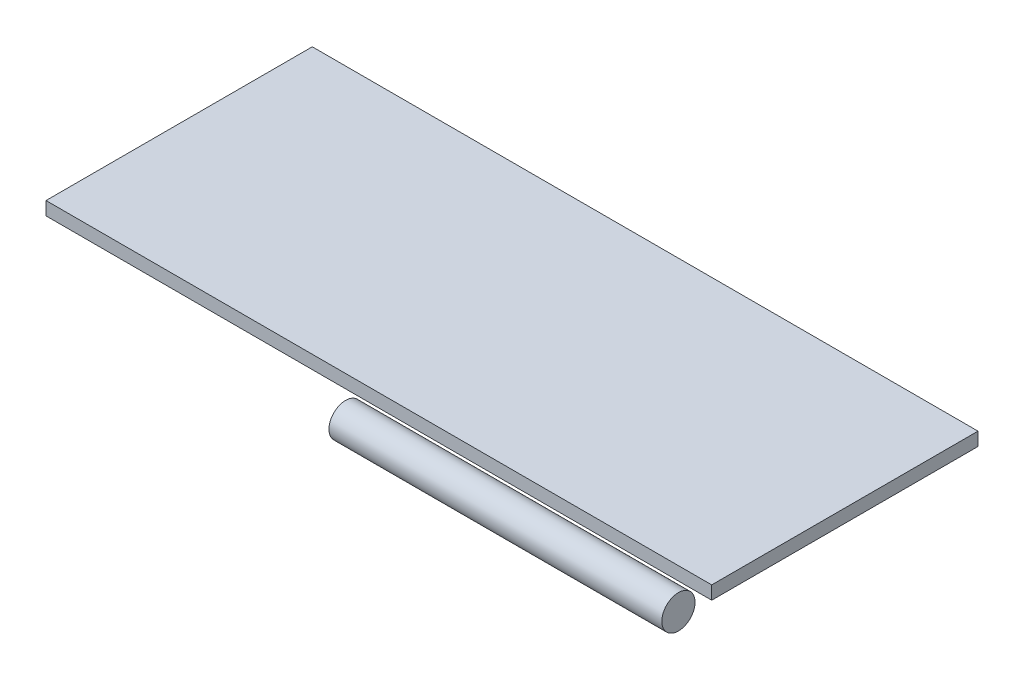
ISO-10303-21;
HEADER;
FILE_DESCRIPTION(('STEP AP214'),'2;1');
FILE_NAME('part.step','',(''),(''),'','','');
FILE_SCHEMA(('AUTOMOTIVE_DESIGN { 1 0 10303 214 1 1 1 1 }'));
ENDSEC;
DATA;
#1=APPLICATION_CONTEXT('core data for automotive mechanical design processes');
#2=APPLICATION_PROTOCOL_DEFINITION('international standard','automotive_design',2000,#1);
#3=PRODUCT_CONTEXT('',#1,'mechanical');
#4=PRODUCT('Part','Part','',(#3));
#5=PRODUCT_RELATED_PRODUCT_CATEGORY('part','',(#4));
#6=PRODUCT_DEFINITION_FORMATION('','',#4);
#7=PRODUCT_DEFINITION_CONTEXT('part definition',#1,'design');
#8=PRODUCT_DEFINITION('design','',#6,#7);
#9=PRODUCT_DEFINITION_SHAPE('','',#8);
#10=(LENGTH_UNIT() NAMED_UNIT(*) SI_UNIT(.MILLI.,.METRE.));
#11=(NAMED_UNIT(*) PLANE_ANGLE_UNIT() SI_UNIT($,.RADIAN.));
#12=(NAMED_UNIT(*) SI_UNIT($,.STERADIAN.) SOLID_ANGLE_UNIT());
#13=UNCERTAINTY_MEASURE_WITH_UNIT(LENGTH_MEASURE(1.E-05),#10,'distance_accuracy_value','');
#14=(GEOMETRIC_REPRESENTATION_CONTEXT(3) GLOBAL_UNCERTAINTY_ASSIGNED_CONTEXT((#13)) GLOBAL_UNIT_ASSIGNED_CONTEXT((#10,
#11,#12)) REPRESENTATION_CONTEXT('',''));
#15=CARTESIAN_POINT('',(0.,0.,0.));
#16=DIRECTION('',(0.,0.,1.));
#17=DIRECTION('',(1.,0.,0.));
#18=AXIS2_PLACEMENT_3D('',#15,#16,#17);
#19=CARTESIAN_POINT('',(0.,0.999999999999999,25.));
#20=DIRECTION('',(1.,0.,0.));
#21=DIRECTION('',(0.,0.,-1.));
#22=AXIS2_PLACEMENT_3D('',#19,#20,#21);
#23=CYLINDRICAL_SURFACE('',#22,2.5);
#24=CARTESIAN_POINT('',(0.,0.999999999999999,25.));
#25=DIRECTION('',(1.,0.,0.));
#26=DIRECTION('',(0.,0.,-1.));
#27=AXIS2_PLACEMENT_3D('',#24,#25,#26);
#28=CIRCLE('',#27,2.5);
#29=CARTESIAN_POINT('',(0.,0.999999999999999,22.5));
#30=VERTEX_POINT('',#29);
#31=EDGE_CURVE('E11',#30,#30,#28,.T.);
#32=ORIENTED_EDGE('',*,*,#31,.T.);
#33=EDGE_LOOP('',(#32));
#34=FACE_BOUND('',#33,.T.);
#35=CARTESIAN_POINT('',(50.,0.999999999999999,25.));
#36=DIRECTION('',(1.,0.,0.));
#37=DIRECTION('',(0.,0.,-1.));
#38=AXIS2_PLACEMENT_3D('',#35,#36,#37);
#39=CIRCLE('',#38,2.5);
#40=CARTESIAN_POINT('',(50.,0.999999999999999,22.5));
#41=VERTEX_POINT('',#40);
#42=EDGE_CURVE('E43',#41,#41,#39,.T.);
#43=ORIENTED_EDGE('',*,*,#42,.F.);
#44=EDGE_LOOP('',(#43));
#45=FACE_BOUND('',#44,.T.);
#46=ADVANCED_FACE('F40',(#34,#45),#23,.T.);
#47=CARTESIAN_POINT('',(0.,0.999999999999999,25.));
#48=DIRECTION('',(1.,0.,0.));
#49=DIRECTION('',(0.,0.,-1.));
#50=AXIS2_PLACEMENT_3D('',#47,#48,#49);
#51=PLANE('',#50);
#52=ORIENTED_EDGE('',*,*,#31,.F.);
#53=EDGE_LOOP('',(#52));
#54=FACE_BOUND('',#53,.T.);
#55=ADVANCED_FACE('F55',(#54),#51,.F.);
#56=CARTESIAN_POINT('',(50.,0.999999999999999,25.));
#57=DIRECTION('',(1.,0.,0.));
#58=DIRECTION('',(0.,0.,-1.));
#59=AXIS2_PLACEMENT_3D('',#56,#57,#58);
#60=PLANE('',#59);
#61=ORIENTED_EDGE('',*,*,#42,.T.);
#62=EDGE_LOOP('',(#61));
#63=FACE_BOUND('',#62,.T.);
#64=ADVANCED_FACE('F52',(#63),#60,.T.);
#65=CLOSED_SHELL('',(#46,#55,#64));
#66=MANIFOLD_SOLID_BREP('B2',#65);
#67=CARTESIAN_POINT('',(50.,2.,20.));
#68=DIRECTION('',(-1.,0.,0.));
#69=DIRECTION('',(0.,0.,1.));
#70=AXIS2_PLACEMENT_3D('',#67,#68,#69);
#71=PLANE('',#70);
#72=DIRECTION('',(0.,0.,-1.));
#73=VECTOR('',#72,1.);
#74=CARTESIAN_POINT('',(50.,0.,20.));
#75=LINE('',#74,#73);
#76=CARTESIAN_POINT('',(50.,0.,20.));
#77=VERTEX_POINT('',#76);
#78=CARTESIAN_POINT('',(50.,0.,-20.));
#79=VERTEX_POINT('',#78);
#80=EDGE_CURVE('E143',#77,#79,#75,.T.);
#81=ORIENTED_EDGE('',*,*,#80,.T.);
#82=DIRECTION('',(0.,-1.,0.));
#83=VECTOR('',#82,1.);
#84=CARTESIAN_POINT('',(50.,2.,-20.));
#85=LINE('',#84,#83);
#86=CARTESIAN_POINT('',(50.,2.,-20.));
#87=VERTEX_POINT('',#86);
#88=EDGE_CURVE('E38',#87,#79,#85,.T.);
#89=ORIENTED_EDGE('',*,*,#88,.F.);
#90=DIRECTION('',(0.,0.,-1.));
#91=VECTOR('',#90,1.);
#92=CARTESIAN_POINT('',(50.,2.,20.));
#93=LINE('',#92,#91);
#94=CARTESIAN_POINT('',(50.,2.,20.));
#95=VERTEX_POINT('',#94);
#96=EDGE_CURVE('E131',#95,#87,#93,.T.);
#97=ORIENTED_EDGE('',*,*,#96,.F.);
#98=DIRECTION('',(0.,-1.,0.));
#99=VECTOR('',#98,1.);
#100=CARTESIAN_POINT('',(50.,2.,20.));
#101=LINE('',#100,#99);
#102=EDGE_CURVE('E139',#95,#77,#101,.T.);
#103=ORIENTED_EDGE('',*,*,#102,.T.);
#104=EDGE_LOOP('',(#81,#89,#97,#103));
#105=FACE_BOUND('',#104,.T.);
#106=ADVANCED_FACE('F80',(#105),#71,.F.);
#107=CARTESIAN_POINT('',(-50.,2.,-20.));
#108=DIRECTION('',(0.,0.,1.));
#109=DIRECTION('',(1.,0.,0.));
#110=AXIS2_PLACEMENT_3D('',#107,#108,#109);
#111=PLANE('',#110);
#112=DIRECTION('',(-1.,0.,0.));
#113=VECTOR('',#112,1.);
#114=CARTESIAN_POINT('',(-50.,0.,-20.));
#115=LINE('',#114,#113);
#116=CARTESIAN_POINT('',(-50.,0.,-20.));
#117=VERTEX_POINT('',#116);
#118=EDGE_CURVE('E135',#79,#117,#115,.T.);
#119=ORIENTED_EDGE('',*,*,#118,.T.);
#120=DIRECTION('',(0.,-1.,0.));
#121=VECTOR('',#120,1.);
#122=CARTESIAN_POINT('',(-50.,2.,-20.));
#123=LINE('',#122,#121);
#124=CARTESIAN_POINT('',(-50.,2.,-20.));
#125=VERTEX_POINT('',#124);
#126=EDGE_CURVE('E88',#125,#117,#123,.T.);
#127=ORIENTED_EDGE('',*,*,#126,.F.);
#128=DIRECTION('',(-1.,0.,0.));
#129=VECTOR('',#128,1.);
#130=CARTESIAN_POINT('',(-50.,2.,-20.));
#131=LINE('',#130,#129);
#132=EDGE_CURVE('E126',#87,#125,#131,.T.);
#133=ORIENTED_EDGE('',*,*,#132,.F.);
#134=ORIENTED_EDGE('',*,*,#88,.T.);
#135=EDGE_LOOP('',(#119,#127,#133,#134));
#136=FACE_BOUND('',#135,.T.);
#137=ADVANCED_FACE('F134',(#136),#111,.F.);
#138=CARTESIAN_POINT('',(-50.,2.,20.));
#139=DIRECTION('',(1.,0.,0.));
#140=DIRECTION('',(0.,0.,-1.));
#141=AXIS2_PLACEMENT_3D('',#138,#139,#140);
#142=PLANE('',#141);
#143=DIRECTION('',(0.,0.,1.));
#144=VECTOR('',#143,1.);
#145=CARTESIAN_POINT('',(-50.,0.,20.));
#146=LINE('',#145,#144);
#147=CARTESIAN_POINT('',(-50.,0.,20.));
#148=VERTEX_POINT('',#147);
#149=EDGE_CURVE('E113',#117,#148,#146,.T.);
#150=ORIENTED_EDGE('',*,*,#149,.T.);
#151=DIRECTION('',(0.,-1.,0.));
#152=VECTOR('',#151,1.);
#153=CARTESIAN_POINT('',(-50.,2.,20.));
#154=LINE('',#153,#152);
#155=CARTESIAN_POINT('',(-50.,2.,20.));
#156=VERTEX_POINT('',#155);
#157=EDGE_CURVE('E136',#156,#148,#154,.T.);
#158=ORIENTED_EDGE('',*,*,#157,.F.);
#159=DIRECTION('',(0.,0.,1.));
#160=VECTOR('',#159,1.);
#161=CARTESIAN_POINT('',(-50.,2.,20.));
#162=LINE('',#161,#160);
#163=EDGE_CURVE('E129',#125,#156,#162,.T.);
#164=ORIENTED_EDGE('',*,*,#163,.F.);
#165=ORIENTED_EDGE('',*,*,#126,.T.);
#166=EDGE_LOOP('',(#150,#158,#164,#165));
#167=FACE_BOUND('',#166,.T.);
#168=ADVANCED_FACE('F137',(#167),#142,.F.);
#169=CARTESIAN_POINT('',(-50.,2.,20.));
#170=DIRECTION('',(0.,0.,-1.));
#171=DIRECTION('',(-1.,0.,0.));
#172=AXIS2_PLACEMENT_3D('',#169,#170,#171);
#173=PLANE('',#172);
#174=DIRECTION('',(1.,0.,0.));
#175=VECTOR('',#174,1.);
#176=CARTESIAN_POINT('',(-50.,0.,20.));
#177=LINE('',#176,#175);
#178=EDGE_CURVE('E119',#148,#77,#177,.T.);
#179=ORIENTED_EDGE('',*,*,#178,.T.);
#180=ORIENTED_EDGE('',*,*,#102,.F.);
#181=DIRECTION('',(1.,0.,0.));
#182=VECTOR('',#181,1.);
#183=CARTESIAN_POINT('',(-50.,2.,20.));
#184=LINE('',#183,#182);
#185=EDGE_CURVE('E96',#156,#95,#184,.T.);
#186=ORIENTED_EDGE('',*,*,#185,.F.);
#187=ORIENTED_EDGE('',*,*,#157,.T.);
#188=EDGE_LOOP('',(#179,#180,#186,#187));
#189=FACE_BOUND('',#188,.T.);
#190=ADVANCED_FACE('F150',(#189),#173,.F.);
#191=CARTESIAN_POINT('',(0.,2.,0.));
#192=DIRECTION('',(0.,-1.,0.));
#193=DIRECTION('',(0.,0.,-1.));
#194=AXIS2_PLACEMENT_3D('',#191,#192,#193);
#195=PLANE('',#194);
#196=ORIENTED_EDGE('',*,*,#96,.T.);
#197=ORIENTED_EDGE('',*,*,#132,.T.);
#198=ORIENTED_EDGE('',*,*,#163,.T.);
#199=ORIENTED_EDGE('',*,*,#185,.T.);
#200=EDGE_LOOP('',(#196,#197,#198,#199));
#201=FACE_BOUND('',#200,.T.);
#202=ADVANCED_FACE('F127',(#201),#195,.F.);
#203=CARTESIAN_POINT('',(0.,0.,0.));
#204=DIRECTION('',(0.,-1.,0.));
#205=DIRECTION('',(0.,0.,-1.));
#206=AXIS2_PLACEMENT_3D('',#203,#204,#205);
#207=PLANE('',#206);
#208=ORIENTED_EDGE('',*,*,#80,.F.);
#209=ORIENTED_EDGE('',*,*,#178,.F.);
#210=ORIENTED_EDGE('',*,*,#149,.F.);
#211=ORIENTED_EDGE('',*,*,#118,.F.);
#212=EDGE_LOOP('',(#208,#209,#210,#211));
#213=FACE_BOUND('',#212,.T.);
#214=ADVANCED_FACE('F153',(#213),#207,.T.);
#215=CLOSED_SHELL('',(#106,#137,#168,#190,#202,#214));
#216=MANIFOLD_SOLID_BREP('B6',#215);
#217=ADVANCED_BREP_SHAPE_REPRESENTATION('',(#18,#66,#216),#14);
#218=SHAPE_DEFINITION_REPRESENTATION(#9,#217);
ENDSEC;
END-ISO-10303-21;
